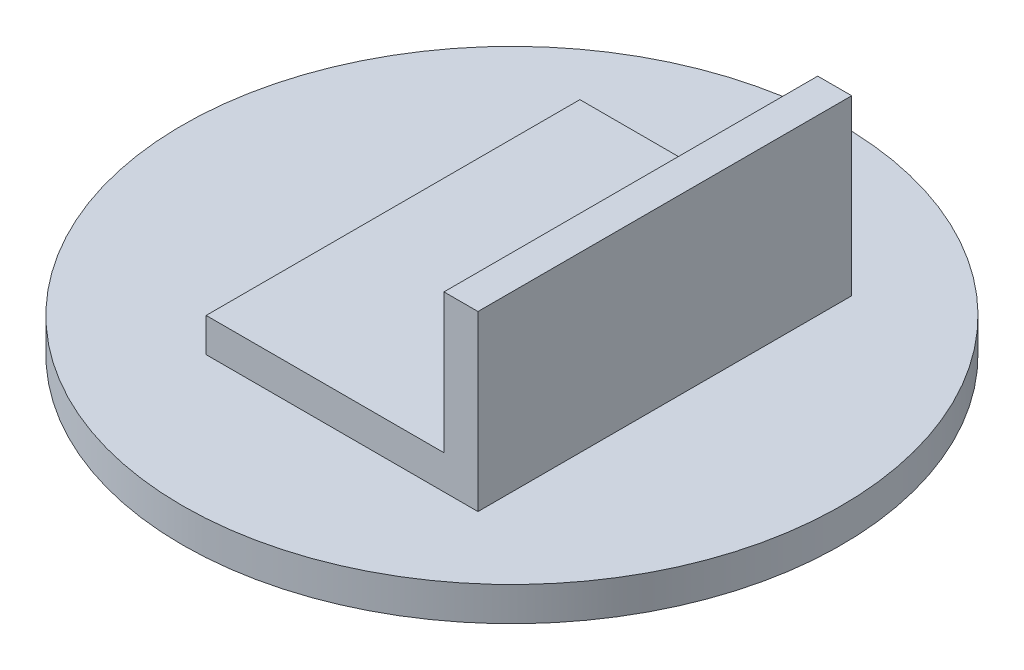
ISO-10303-21;
HEADER;
FILE_DESCRIPTION(('STEP AP214'),'2;1');
FILE_NAME('part.step','',(''),(''),'','','');
FILE_SCHEMA(('AUTOMOTIVE_DESIGN { 1 0 10303 214 1 1 1 1 }'));
ENDSEC;
DATA;
#1=APPLICATION_CONTEXT('core data for automotive mechanical design processes');
#2=APPLICATION_PROTOCOL_DEFINITION('international standard','automotive_design',2000,#1);
#3=PRODUCT_CONTEXT('',#1,'mechanical');
#4=PRODUCT('Part','Part','',(#3));
#5=PRODUCT_RELATED_PRODUCT_CATEGORY('part','',(#4));
#6=PRODUCT_DEFINITION_FORMATION('','',#4);
#7=PRODUCT_DEFINITION_CONTEXT('part definition',#1,'design');
#8=PRODUCT_DEFINITION('design','',#6,#7);
#9=PRODUCT_DEFINITION_SHAPE('','',#8);
#10=(LENGTH_UNIT() NAMED_UNIT(*) SI_UNIT(.MILLI.,.METRE.));
#11=(NAMED_UNIT(*) PLANE_ANGLE_UNIT() SI_UNIT($,.RADIAN.));
#12=(NAMED_UNIT(*) SI_UNIT($,.STERADIAN.) SOLID_ANGLE_UNIT());
#13=UNCERTAINTY_MEASURE_WITH_UNIT(LENGTH_MEASURE(1.E-05),#10,'distance_accuracy_value','');
#14=(GEOMETRIC_REPRESENTATION_CONTEXT(3) GLOBAL_UNCERTAINTY_ASSIGNED_CONTEXT((#13)) GLOBAL_UNIT_ASSIGNED_CONTEXT((#10,
#11,#12)) REPRESENTATION_CONTEXT('',''));
#15=CARTESIAN_POINT('',(0.,0.,0.));
#16=DIRECTION('',(0.,0.,1.));
#17=DIRECTION('',(1.,0.,0.));
#18=AXIS2_PLACEMENT_3D('',#15,#16,#17);
#19=CARTESIAN_POINT('',(0.,5.,0.));
#20=DIRECTION('',(0.,1.,0.));
#21=DIRECTION('',(0.,0.,1.));
#22=AXIS2_PLACEMENT_3D('',#19,#20,#21);
#23=PLANE('',#22);
#24=CARTESIAN_POINT('',(0.,5.,0.));
#25=DIRECTION('',(0.,1.,0.));
#26=DIRECTION('',(0.,0.,1.));
#27=AXIS2_PLACEMENT_3D('',#24,#25,#26);
#28=CIRCLE('',#27,48.5);
#29=CARTESIAN_POINT('',(0.,5.,48.5));
#30=VERTEX_POINT('',#29);
#31=EDGE_CURVE('E11',#30,#30,#28,.T.);
#32=ORIENTED_EDGE('',*,*,#31,.T.);
#33=EDGE_LOOP('',(#32));
#34=FACE_BOUND('',#33,.T.);
#35=DIRECTION('',(0.,0.,-1.));
#36=VECTOR('',#35,1.);
#37=CARTESIAN_POINT('',(22.5,5.,-27.5));
#38=LINE('',#37,#36);
#39=CARTESIAN_POINT('',(22.5,5.,27.5));
#40=VERTEX_POINT('',#39);
#41=CARTESIAN_POINT('',(22.5,5.,-27.5));
#42=VERTEX_POINT('',#41);
#43=EDGE_CURVE('E106',#40,#42,#38,.T.);
#44=ORIENTED_EDGE('',*,*,#43,.F.);
#45=DIRECTION('',(1.,0.,0.));
#46=VECTOR('',#45,1.);
#47=CARTESIAN_POINT('',(17.5,5.,27.5));
#48=LINE('',#47,#46);
#49=CARTESIAN_POINT('',(-17.5,5.,27.5));
#50=VERTEX_POINT('',#49);
#51=EDGE_CURVE('E55',#50,#40,#48,.T.);
#52=ORIENTED_EDGE('',*,*,#51,.F.);
#53=DIRECTION('',(0.,0.,1.));
#54=VECTOR('',#53,1.);
#55=CARTESIAN_POINT('',(-17.5,5.,-27.5));
#56=LINE('',#55,#54);
#57=CARTESIAN_POINT('',(-17.5,5.,-27.5));
#58=VERTEX_POINT('',#57);
#59=EDGE_CURVE('E50',#58,#50,#56,.T.);
#60=ORIENTED_EDGE('',*,*,#59,.F.);
#61=DIRECTION('',(-1.,0.,0.));
#62=VECTOR('',#61,1.);
#63=CARTESIAN_POINT('',(17.5,5.,-27.5));
#64=LINE('',#63,#62);
#65=EDGE_CURVE('E138',#42,#58,#64,.T.);
#66=ORIENTED_EDGE('',*,*,#65,.F.);
#67=EDGE_LOOP('',(#44,#52,#60,#66));
#68=FACE_BOUND('',#67,.T.);
#69=ADVANCED_FACE('F35',(#34,#68),#23,.T.);
#70=CARTESIAN_POINT('',(0.,5.,0.));
#71=DIRECTION('',(0.,-1.,0.));
#72=DIRECTION('',(0.,0.,-1.));
#73=AXIS2_PLACEMENT_3D('',#70,#71,#72);
#74=CYLINDRICAL_SURFACE('',#73,48.5);
#75=ORIENTED_EDGE('',*,*,#31,.F.);
#76=EDGE_LOOP('',(#75));
#77=FACE_BOUND('',#76,.T.);
#78=CARTESIAN_POINT('',(0.,0.,0.));
#79=DIRECTION('',(0.,1.,0.));
#80=DIRECTION('',(0.,0.,1.));
#81=AXIS2_PLACEMENT_3D('',#78,#79,#80);
#82=CIRCLE('',#81,48.5);
#83=CARTESIAN_POINT('',(0.,0.,48.5));
#84=VERTEX_POINT('',#83);
#85=EDGE_CURVE('E39',#84,#84,#82,.T.);
#86=ORIENTED_EDGE('',*,*,#85,.T.);
#87=EDGE_LOOP('',(#86));
#88=FACE_BOUND('',#87,.T.);
#89=ADVANCED_FACE('F37',(#77,#88),#74,.T.);
#90=CARTESIAN_POINT('',(0.,0.,0.));
#91=DIRECTION('',(0.,1.,0.));
#92=DIRECTION('',(0.,0.,1.));
#93=AXIS2_PLACEMENT_3D('',#90,#91,#92);
#94=PLANE('',#93);
#95=CARTESIAN_POINT('',(0.,0.,0.));
#96=DIRECTION('',(0.,-1.,0.));
#97=DIRECTION('',(0.,0.,-1.));
#98=AXIS2_PLACEMENT_3D('',#95,#96,#97);
#99=CIRCLE('',#98,3.75);
#100=CARTESIAN_POINT('',(0.,0.,-3.75));
#101=VERTEX_POINT('',#100);
#102=EDGE_CURVE('E111',#101,#101,#99,.T.);
#103=ORIENTED_EDGE('',*,*,#102,.F.);
#104=EDGE_LOOP('',(#103));
#105=FACE_BOUND('',#104,.T.);
#106=CARTESIAN_POINT('',(0.,0.,7.25));
#107=DIRECTION('',(0.,-1.,0.));
#108=DIRECTION('',(0.,0.,-1.));
#109=AXIS2_PLACEMENT_3D('',#106,#107,#108);
#110=CIRCLE('',#109,1.5);
#111=CARTESIAN_POINT('',(0.,0.,5.75));
#112=VERTEX_POINT('',#111);
#113=EDGE_CURVE('E126',#112,#112,#110,.T.);
#114=ORIENTED_EDGE('',*,*,#113,.F.);
#115=EDGE_LOOP('',(#114));
#116=FACE_BOUND('',#115,.T.);
#117=CARTESIAN_POINT('',(0.,0.,-7.25));
#118=DIRECTION('',(0.,-1.,0.));
#119=DIRECTION('',(0.,0.,-1.));
#120=AXIS2_PLACEMENT_3D('',#117,#118,#119);
#121=CIRCLE('',#120,1.5);
#122=CARTESIAN_POINT('',(0.,0.,-8.75));
#123=VERTEX_POINT('',#122);
#124=EDGE_CURVE('E121',#123,#123,#121,.T.);
#125=ORIENTED_EDGE('',*,*,#124,.F.);
#126=EDGE_LOOP('',(#125));
#127=FACE_BOUND('',#126,.T.);
#128=ORIENTED_EDGE('',*,*,#85,.F.);
#129=EDGE_LOOP('',(#128));
#130=FACE_BOUND('',#129,.T.);
#131=ADVANCED_FACE('F155',(#105,#116,#127,#130),#94,.F.);
#132=CARTESIAN_POINT('',(-17.5,10.,-27.5));
#133=DIRECTION('',(1.,0.,0.));
#134=DIRECTION('',(0.,0.,-1.));
#135=AXIS2_PLACEMENT_3D('',#132,#133,#134);
#136=PLANE('',#135);
#137=ORIENTED_EDGE('',*,*,#59,.T.);
#138=DIRECTION('',(0.,-1.,0.));
#139=VECTOR('',#138,1.);
#140=CARTESIAN_POINT('',(-17.5,10.,27.5));
#141=LINE('',#140,#139);
#142=CARTESIAN_POINT('',(-17.5,10.,27.5));
#143=VERTEX_POINT('',#142);
#144=EDGE_CURVE('E149',#143,#50,#141,.T.);
#145=ORIENTED_EDGE('',*,*,#144,.F.);
#146=DIRECTION('',(0.,0.,1.));
#147=VECTOR('',#146,1.);
#148=CARTESIAN_POINT('',(-17.5,10.,-27.5));
#149=LINE('',#148,#147);
#150=CARTESIAN_POINT('',(-17.5,10.,-27.5));
#151=VERTEX_POINT('',#150);
#152=EDGE_CURVE('E134',#151,#143,#149,.T.);
#153=ORIENTED_EDGE('',*,*,#152,.F.);
#154=DIRECTION('',(0.,-1.,0.));
#155=VECTOR('',#154,1.);
#156=CARTESIAN_POINT('',(-17.5,10.,-27.5));
#157=LINE('',#156,#155);
#158=EDGE_CURVE('E143',#151,#58,#157,.T.);
#159=ORIENTED_EDGE('',*,*,#158,.T.);
#160=EDGE_LOOP('',(#137,#145,#153,#159));
#161=FACE_BOUND('',#160,.T.);
#162=ADVANCED_FACE('F157',(#161),#136,.F.);
#163=CARTESIAN_POINT('',(17.5,10.,27.5));
#164=DIRECTION('',(0.,0.,-1.));
#165=DIRECTION('',(-1.,0.,0.));
#166=AXIS2_PLACEMENT_3D('',#163,#164,#165);
#167=PLANE('',#166);
#168=ORIENTED_EDGE('',*,*,#51,.T.);
#169=DIRECTION('',(0.,-1.,0.));
#170=VECTOR('',#169,1.);
#171=CARTESIAN_POINT('',(22.5,30.5,27.5));
#172=LINE('',#171,#170);
#173=CARTESIAN_POINT('',(22.5,30.5,27.5));
#174=VERTEX_POINT('',#173);
#175=EDGE_CURVE('E94',#174,#40,#172,.T.);
#176=ORIENTED_EDGE('',*,*,#175,.F.);
#177=DIRECTION('',(1.,0.,0.));
#178=VECTOR('',#177,1.);
#179=CARTESIAN_POINT('',(17.5,30.5,27.5));
#180=LINE('',#179,#178);
#181=CARTESIAN_POINT('',(17.5,30.5,27.5));
#182=VERTEX_POINT('',#181);
#183=EDGE_CURVE('E87',#182,#174,#180,.T.);
#184=ORIENTED_EDGE('',*,*,#183,.F.);
#185=DIRECTION('',(0.,-1.,0.));
#186=VECTOR('',#185,1.);
#187=CARTESIAN_POINT('',(17.5,30.5,27.5));
#188=LINE('',#187,#186);
#189=CARTESIAN_POINT('',(17.5,10.,27.5));
#190=VERTEX_POINT('',#189);
#191=EDGE_CURVE('E91',#182,#190,#188,.T.);
#192=ORIENTED_EDGE('',*,*,#191,.T.);
#193=DIRECTION('',(1.,0.,0.));
#194=VECTOR('',#193,1.);
#195=CARTESIAN_POINT('',(17.5,10.,27.5));
#196=LINE('',#195,#194);
#197=EDGE_CURVE('E137',#143,#190,#196,.T.);
#198=ORIENTED_EDGE('',*,*,#197,.F.);
#199=ORIENTED_EDGE('',*,*,#144,.T.);
#200=EDGE_LOOP('',(#168,#176,#184,#192,#198,#199));
#201=FACE_BOUND('',#200,.T.);
#202=ADVANCED_FACE('F89',(#201),#167,.F.);
#203=CARTESIAN_POINT('',(17.5,10.,-27.5));
#204=DIRECTION('',(0.,0.,1.));
#205=DIRECTION('',(1.,0.,0.));
#206=AXIS2_PLACEMENT_3D('',#203,#204,#205);
#207=PLANE('',#206);
#208=ORIENTED_EDGE('',*,*,#65,.T.);
#209=ORIENTED_EDGE('',*,*,#158,.F.);
#210=DIRECTION('',(-1.,0.,0.));
#211=VECTOR('',#210,1.);
#212=CARTESIAN_POINT('',(17.5,10.,-27.5));
#213=LINE('',#212,#211);
#214=CARTESIAN_POINT('',(17.5,10.,-27.5));
#215=VERTEX_POINT('',#214);
#216=EDGE_CURVE('E141',#215,#151,#213,.T.);
#217=ORIENTED_EDGE('',*,*,#216,.F.);
#218=DIRECTION('',(0.,-1.,0.));
#219=VECTOR('',#218,1.);
#220=CARTESIAN_POINT('',(17.5,30.5,-27.5));
#221=LINE('',#220,#219);
#222=CARTESIAN_POINT('',(17.5,30.5,-27.5));
#223=VERTEX_POINT('',#222);
#224=EDGE_CURVE('E298',#223,#215,#221,.T.);
#225=ORIENTED_EDGE('',*,*,#224,.F.);
#226=DIRECTION('',(-1.,0.,0.));
#227=VECTOR('',#226,1.);
#228=CARTESIAN_POINT('',(17.5,30.5,-27.5));
#229=LINE('',#228,#227);
#230=CARTESIAN_POINT('',(22.5,30.5,-27.5));
#231=VERTEX_POINT('',#230);
#232=EDGE_CURVE('E103',#231,#223,#229,.T.);
#233=ORIENTED_EDGE('',*,*,#232,.F.);
#234=DIRECTION('',(0.,-1.,0.));
#235=VECTOR('',#234,1.);
#236=CARTESIAN_POINT('',(22.5,30.5,-27.5));
#237=LINE('',#236,#235);
#238=EDGE_CURVE('E116',#231,#42,#237,.T.);
#239=ORIENTED_EDGE('',*,*,#238,.T.);
#240=EDGE_LOOP('',(#208,#209,#217,#225,#233,#239));
#241=FACE_BOUND('',#240,.T.);
#242=ADVANCED_FACE('F176',(#241),#207,.F.);
#243=CARTESIAN_POINT('',(0.,10.,0.));
#244=DIRECTION('',(0.,-1.,0.));
#245=DIRECTION('',(0.,0.,-1.));
#246=AXIS2_PLACEMENT_3D('',#243,#244,#245);
#247=PLANE('',#246);
#248=CARTESIAN_POINT('',(0.,10.,7.25));
#249=DIRECTION('',(0.,-1.,0.));
#250=DIRECTION('',(0.,0.,-1.));
#251=AXIS2_PLACEMENT_3D('',#248,#249,#250);
#252=CIRCLE('',#251,1.5);
#253=CARTESIAN_POINT('',(0.,10.,5.75));
#254=VERTEX_POINT('',#253);
#255=EDGE_CURVE('E123',#254,#254,#252,.T.);
#256=ORIENTED_EDGE('',*,*,#255,.T.);
#257=EDGE_LOOP('',(#256));
#258=FACE_BOUND('',#257,.T.);
#259=CARTESIAN_POINT('',(0.,10.,-7.25));
#260=DIRECTION('',(0.,-1.,0.));
#261=DIRECTION('',(0.,0.,-1.));
#262=AXIS2_PLACEMENT_3D('',#259,#260,#261);
#263=CIRCLE('',#262,1.5);
#264=CARTESIAN_POINT('',(0.,10.,-8.75));
#265=VERTEX_POINT('',#264);
#266=EDGE_CURVE('E129',#265,#265,#263,.T.);
#267=ORIENTED_EDGE('',*,*,#266,.T.);
#268=EDGE_LOOP('',(#267));
#269=FACE_BOUND('',#268,.T.);
#270=ORIENTED_EDGE('',*,*,#152,.T.);
#271=ORIENTED_EDGE('',*,*,#197,.T.);
#272=DIRECTION('',(0.,0.,-1.));
#273=VECTOR('',#272,1.);
#274=CARTESIAN_POINT('',(17.5,10.,-27.5));
#275=LINE('',#274,#273);
#276=EDGE_CURVE('E110',#190,#215,#275,.T.);
#277=ORIENTED_EDGE('',*,*,#276,.T.);
#278=ORIENTED_EDGE('',*,*,#216,.T.);
#279=EDGE_LOOP('',(#270,#271,#277,#278));
#280=FACE_BOUND('',#279,.T.);
#281=ADVANCED_FACE('F179',(#258,#269,#280),#247,.F.);
#282=CARTESIAN_POINT('',(0.,10.,-7.25));
#283=DIRECTION('',(0.,-1.,0.));
#284=DIRECTION('',(0.,0.,-1.));
#285=AXIS2_PLACEMENT_3D('',#282,#283,#284);
#286=CYLINDRICAL_SURFACE('',#285,1.5);
#287=ORIENTED_EDGE('',*,*,#266,.F.);
#288=EDGE_LOOP('',(#287));
#289=FACE_BOUND('',#288,.T.);
#290=ORIENTED_EDGE('',*,*,#124,.T.);
#291=EDGE_LOOP('',(#290));
#292=FACE_BOUND('',#291,.T.);
#293=ADVANCED_FACE('F183',(#289,#292),#286,.F.);
#294=CARTESIAN_POINT('',(0.,10.,7.25));
#295=DIRECTION('',(0.,-1.,0.));
#296=DIRECTION('',(0.,0.,-1.));
#297=AXIS2_PLACEMENT_3D('',#294,#295,#296);
#298=CYLINDRICAL_SURFACE('',#297,1.5);
#299=ORIENTED_EDGE('',*,*,#255,.F.);
#300=EDGE_LOOP('',(#299));
#301=FACE_BOUND('',#300,.T.);
#302=ORIENTED_EDGE('',*,*,#113,.T.);
#303=EDGE_LOOP('',(#302));
#304=FACE_BOUND('',#303,.T.);
#305=ADVANCED_FACE('F187',(#301,#304),#298,.F.);
#306=CARTESIAN_POINT('',(0.,1.5,0.));
#307=DIRECTION('',(0.,-1.,0.));
#308=DIRECTION('',(0.,0.,-1.));
#309=AXIS2_PLACEMENT_3D('',#306,#307,#308);
#310=CYLINDRICAL_SURFACE('',#309,3.75);
#311=CARTESIAN_POINT('',(0.,1.5,0.));
#312=DIRECTION('',(0.,-1.,0.));
#313=DIRECTION('',(0.,0.,-1.));
#314=AXIS2_PLACEMENT_3D('',#311,#312,#313);
#315=CIRCLE('',#314,3.75);
#316=CARTESIAN_POINT('',(0.,1.5,-3.75));
#317=VERTEX_POINT('',#316);
#318=EDGE_CURVE('E114',#317,#317,#315,.T.);
#319=ORIENTED_EDGE('',*,*,#318,.F.);
#320=EDGE_LOOP('',(#319));
#321=FACE_BOUND('',#320,.T.);
#322=ORIENTED_EDGE('',*,*,#102,.T.);
#323=EDGE_LOOP('',(#322));
#324=FACE_BOUND('',#323,.T.);
#325=ADVANCED_FACE('F191',(#321,#324),#310,.F.);
#326=CARTESIAN_POINT('',(0.,1.5,0.));
#327=DIRECTION('',(0.,-1.,0.));
#328=DIRECTION('',(0.,0.,-1.));
#329=AXIS2_PLACEMENT_3D('',#326,#327,#328);
#330=PLANE('',#329);
#331=ORIENTED_EDGE('',*,*,#318,.T.);
#332=EDGE_LOOP('',(#331));
#333=FACE_BOUND('',#332,.T.);
#334=ADVANCED_FACE('F195',(#333),#330,.T.);
#335=CARTESIAN_POINT('',(17.5,30.5,-27.5));
#336=DIRECTION('',(1.,0.,0.));
#337=DIRECTION('',(0.,0.,-1.));
#338=AXIS2_PLACEMENT_3D('',#335,#336,#337);
#339=PLANE('',#338);
#340=ORIENTED_EDGE('',*,*,#224,.T.);
#341=ORIENTED_EDGE('',*,*,#276,.F.);
#342=ORIENTED_EDGE('',*,*,#191,.F.);
#343=DIRECTION('',(0.,0.,1.));
#344=VECTOR('',#343,1.);
#345=CARTESIAN_POINT('',(17.5,30.5,-27.5));
#346=LINE('',#345,#344);
#347=EDGE_CURVE('E98',#223,#182,#346,.T.);
#348=ORIENTED_EDGE('',*,*,#347,.F.);
#349=EDGE_LOOP('',(#340,#341,#342,#348));
#350=FACE_BOUND('',#349,.T.);
#351=ADVANCED_FACE('F108',(#350),#339,.F.);
#352=CARTESIAN_POINT('',(22.5,30.5,-27.5));
#353=DIRECTION('',(-1.,0.,0.));
#354=DIRECTION('',(0.,0.,1.));
#355=AXIS2_PLACEMENT_3D('',#352,#353,#354);
#356=PLANE('',#355);
#357=ORIENTED_EDGE('',*,*,#43,.T.);
#358=ORIENTED_EDGE('',*,*,#238,.F.);
#359=DIRECTION('',(0.,0.,-1.));
#360=VECTOR('',#359,1.);
#361=CARTESIAN_POINT('',(22.5,30.5,-27.5));
#362=LINE('',#361,#360);
#363=EDGE_CURVE('E97',#174,#231,#362,.T.);
#364=ORIENTED_EDGE('',*,*,#363,.F.);
#365=ORIENTED_EDGE('',*,*,#175,.T.);
#366=EDGE_LOOP('',(#357,#358,#364,#365));
#367=FACE_BOUND('',#366,.T.);
#368=ADVANCED_FACE('F202',(#367),#356,.F.);
#369=CARTESIAN_POINT('',(0.,30.5,0.));
#370=DIRECTION('',(0.,1.,0.));
#371=DIRECTION('',(0.,0.,1.));
#372=AXIS2_PLACEMENT_3D('',#369,#370,#371);
#373=PLANE('',#372);
#374=ORIENTED_EDGE('',*,*,#347,.T.);
#375=ORIENTED_EDGE('',*,*,#183,.T.);
#376=ORIENTED_EDGE('',*,*,#363,.T.);
#377=ORIENTED_EDGE('',*,*,#232,.T.);
#378=EDGE_LOOP('',(#374,#375,#376,#377));
#379=FACE_BOUND('',#378,.T.);
#380=ADVANCED_FACE('F101',(#379),#373,.T.);
#381=CLOSED_SHELL('',(#69,#89,#131,#162,#202,#242,#281,#293,#305,#325,#334,#351,#368,#380));
#382=MANIFOLD_SOLID_BREP('B2',#381);
#383=ADVANCED_BREP_SHAPE_REPRESENTATION('',(#18,#382),#14);
#384=SHAPE_DEFINITION_REPRESENTATION(#9,#383);
ENDSEC;
END-ISO-10303-21;
